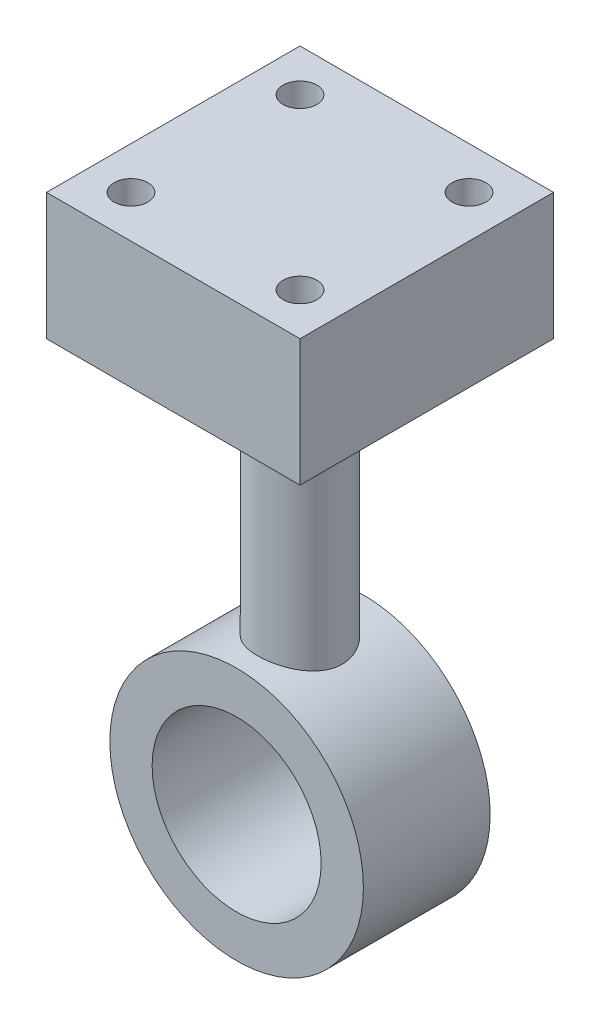
ISO-10303-21;
HEADER;
FILE_DESCRIPTION(('STEP AP214'),'2;1');
FILE_NAME('part.step','',(''),(''),'','','');
FILE_SCHEMA(('AUTOMOTIVE_DESIGN { 1 0 10303 214 1 1 1 1 }'));
ENDSEC;
DATA;
#1=APPLICATION_CONTEXT('core data for automotive mechanical design processes');
#2=APPLICATION_PROTOCOL_DEFINITION('international standard','automotive_design',2000,#1);
#3=PRODUCT_CONTEXT('',#1,'mechanical');
#4=PRODUCT('Part','Part','',(#3));
#5=PRODUCT_RELATED_PRODUCT_CATEGORY('part','',(#4));
#6=PRODUCT_DEFINITION_FORMATION('','',#4);
#7=PRODUCT_DEFINITION_CONTEXT('part definition',#1,'design');
#8=PRODUCT_DEFINITION('design','',#6,#7);
#9=PRODUCT_DEFINITION_SHAPE('','',#8);
#10=(LENGTH_UNIT() NAMED_UNIT(*) SI_UNIT(.MILLI.,.METRE.));
#11=(NAMED_UNIT(*) PLANE_ANGLE_UNIT() SI_UNIT($,.RADIAN.));
#12=(NAMED_UNIT(*) SI_UNIT($,.STERADIAN.) SOLID_ANGLE_UNIT());
#13=UNCERTAINTY_MEASURE_WITH_UNIT(LENGTH_MEASURE(1.E-05),#10,'distance_accuracy_value','');
#14=(GEOMETRIC_REPRESENTATION_CONTEXT(3) GLOBAL_UNCERTAINTY_ASSIGNED_CONTEXT((#13)) GLOBAL_UNIT_ASSIGNED_CONTEXT((#10,
#11,#12)) REPRESENTATION_CONTEXT('',''));
#15=CARTESIAN_POINT('',(0.,0.,0.));
#16=DIRECTION('',(0.,0.,1.));
#17=DIRECTION('',(1.,0.,0.));
#18=AXIS2_PLACEMENT_3D('',#15,#16,#17);
#19=CARTESIAN_POINT('',(0.,0.,7.5));
#20=DIRECTION('',(0.,0.,1.));
#21=DIRECTION('',(1.,0.,0.));
#22=AXIS2_PLACEMENT_3D('',#19,#20,#21);
#23=PLANE('',#22);
#24=CARTESIAN_POINT('',(0.,0.,7.5));
#25=DIRECTION('',(0.,0.,1.));
#26=DIRECTION('',(1.,0.,0.));
#27=AXIS2_PLACEMENT_3D('',#24,#25,#26);
#28=CIRCLE('',#27,15.);
#29=CARTESIAN_POINT('',(15.,0.,7.5));
#30=VERTEX_POINT('',#29);
#31=EDGE_CURVE('E11',#30,#30,#28,.T.);
#32=ORIENTED_EDGE('',*,*,#31,.T.);
#33=EDGE_LOOP('',(#32));
#34=FACE_BOUND('',#33,.T.);
#35=CARTESIAN_POINT('',(0.,0.,7.5));
#36=DIRECTION('',(0.,0.,1.));
#37=DIRECTION('',(1.,0.,0.));
#38=AXIS2_PLACEMENT_3D('',#35,#36,#37);
#39=CIRCLE('',#38,10.);
#40=CARTESIAN_POINT('',(10.,0.,7.5));
#41=VERTEX_POINT('',#40);
#42=EDGE_CURVE('E144',#41,#41,#39,.T.);
#43=ORIENTED_EDGE('',*,*,#42,.F.);
#44=EDGE_LOOP('',(#43));
#45=FACE_BOUND('',#44,.T.);
#46=ADVANCED_FACE('F39',(#34,#45),#23,.T.);
#47=CARTESIAN_POINT('',(0.,0.,-7.5));
#48=DIRECTION('',(0.,0.,1.));
#49=DIRECTION('',(1.,0.,0.));
#50=AXIS2_PLACEMENT_3D('',#47,#48,#49);
#51=PLANE('',#50);
#52=CARTESIAN_POINT('',(0.,0.,-7.5));
#53=DIRECTION('',(0.,0.,1.));
#54=DIRECTION('',(1.,0.,0.));
#55=AXIS2_PLACEMENT_3D('',#52,#53,#54);
#56=CIRCLE('',#55,15.);
#57=CARTESIAN_POINT('',(15.,0.,-7.5));
#58=VERTEX_POINT('',#57);
#59=EDGE_CURVE('E50',#58,#58,#56,.T.);
#60=ORIENTED_EDGE('',*,*,#59,.F.);
#61=EDGE_LOOP('',(#60));
#62=FACE_BOUND('',#61,.T.);
#63=CARTESIAN_POINT('',(0.,0.,-7.5));
#64=DIRECTION('',(0.,0.,1.));
#65=DIRECTION('',(1.,0.,0.));
#66=AXIS2_PLACEMENT_3D('',#63,#64,#65);
#67=CIRCLE('',#66,10.);
#68=CARTESIAN_POINT('',(10.,0.,-7.5));
#69=VERTEX_POINT('',#68);
#70=EDGE_CURVE('E143',#69,#69,#67,.T.);
#71=ORIENTED_EDGE('',*,*,#70,.T.);
#72=EDGE_LOOP('',(#71));
#73=FACE_BOUND('',#72,.T.);
#74=ADVANCED_FACE('F189',(#62,#73),#51,.F.);
#75=CARTESIAN_POINT('',(0.,0.,7.5));
#76=DIRECTION('',(0.,0.,-1.));
#77=DIRECTION('',(-1.,0.,0.));
#78=AXIS2_PLACEMENT_3D('',#75,#76,#77);
#79=CYLINDRICAL_SURFACE('',#78,15.);
#80=CARTESIAN_POINT('',(0.,15.,5.));
#81=CARTESIAN_POINT('',(0.272816814433608,15.0000007650471,5.00000126865821));
#82=CARTESIAN_POINT('',(0.54562597269272,14.9924884753769,4.97759866936396));
#83=CARTESIAN_POINT('',(1.08320880436489,14.9632605101644,4.88885445591387));
#84=CARTESIAN_POINT('',(1.3479816405942,14.941543360109,4.82250828025524));
#85=CARTESIAN_POINT('',(1.86166394750877,14.8862653953208,4.64840378307991));
#86=CARTESIAN_POINT('',(2.11059912942976,14.8527243865377,4.5407146877042));
#87=CARTESIAN_POINT('',(2.58687468402704,14.7772222858721,4.2872941358077));
#88=CARTESIAN_POINT('',(2.81421078479507,14.7352595334076,4.1415551749849));
#89=CARTESIAN_POINT('',(3.24870837510974,14.6457047221309,3.8108709757084));
#90=CARTESIAN_POINT('',(3.45501850148552,14.5979778231161,3.62484382870571));
#91=CARTESIAN_POINT('',(3.83416346351645,14.5030157392292,3.22116422645899));
#92=CARTESIAN_POINT('',(4.00699092746984,14.4557806648007,3.00350482532687));
#93=CARTESIAN_POINT('',(4.31912471111898,14.3656666235818,2.53507442404485));
#94=CARTESIAN_POINT('',(4.45732429102251,14.3229519627198,2.28353130144922));
#95=CARTESIAN_POINT('',(4.68909436930558,14.2487652698844,1.75911952782114));
#96=CARTESIAN_POINT('',(4.78267848691248,14.2172898077928,1.48625741422144));
#97=CARTESIAN_POINT('',(4.91936730756488,14.1705651637056,0.936633892488757));
#98=CARTESIAN_POINT('',(4.96406724136036,14.1548047884338,0.660313957540243));
#99=CARTESIAN_POINT('',(5.00670561667087,14.1397828315221,0.103681229235027));
#100=CARTESIAN_POINT('',(5.00465850803659,14.1405161515599,-0.176630303515914));
#101=CARTESIAN_POINT('',(4.95509951850356,14.1579507500054,-0.719683152261156));
#102=CARTESIAN_POINT('',(4.90966956578088,14.1739207918415,-0.982642014718556));
#103=CARTESIAN_POINT('',(4.77803081419367,14.2188328846856,-1.49696709815057));
#104=CARTESIAN_POINT('',(4.69181713294739,14.2477764887883,-1.74833192720231));
#105=CARTESIAN_POINT('',(4.47969529031769,14.3158955569848,-2.2370637479197));
#106=CARTESIAN_POINT('',(4.35317024354078,14.3552282897692,-2.47414012733751));
#107=CARTESIAN_POINT('',(4.06444553151123,14.4396279286729,-2.92435454140875));
#108=CARTESIAN_POINT('',(3.9022355618188,14.4846964894921,-3.13748563466968));
#109=CARTESIAN_POINT('',(3.53674666341248,14.5783664584198,-3.54545799080094));
#110=CARTESIAN_POINT('',(3.3317657503819,14.6270294677509,-3.73876347254456));
#111=CARTESIAN_POINT('',(2.89169784984998,14.7203469193431,-4.08865633331777));
#112=CARTESIAN_POINT('',(2.65660797830398,14.765000976901,-4.24524019082269));
#113=CARTESIAN_POINT('',(2.15973806523143,14.8458553968921,-4.51848150117513));
#114=CARTESIAN_POINT('',(1.89771638208171,14.8819675004026,-4.6347274567036));
#115=CARTESIAN_POINT('',(1.35634541682251,14.9410283572211,-4.82101586977861));
#116=CARTESIAN_POINT('',(1.07700219077476,14.9639816827438,-4.8910743771172));
#117=CARTESIAN_POINT('',(0.521919147646527,14.9933813535722,-4.98027833011178));
#118=CARTESIAN_POINT('',(0.246547999324233,15.0005000916864,-5.00149904586375));
#119=CARTESIAN_POINT('',(-0.303875349801188,14.9994451347413,-4.99833663200766));
#120=CARTESIAN_POINT('',(-0.578927596598252,14.9912740209681,-4.97396120010062));
#121=CARTESIAN_POINT('',(-1.11259933152128,14.9610012358552,-4.88194046132021));
#122=CARTESIAN_POINT('',(-1.37146403417421,14.9393099355596,-4.81556896975253));
#123=CARTESIAN_POINT('',(-1.87427979289787,14.8845923415035,-4.64303277766636));
#124=CARTESIAN_POINT('',(-2.11822894254303,14.8515646023338,-4.53686300266107));
#125=CARTESIAN_POINT('',(-2.59144148196636,14.7764465643645,-4.28464784079607));
#126=CARTESIAN_POINT('',(-2.82014979608573,14.7341407377893,-4.13762703358415));
#127=CARTESIAN_POINT('',(-3.25032415067793,14.6452626958131,-3.80902924993259));
#128=CARTESIAN_POINT('',(-3.45178183897788,14.5986891796914,-3.62744171984118));
#129=CARTESIAN_POINT('',(-3.8312625390315,14.5038423990222,-3.22510624496706));
#130=CARTESIAN_POINT('',(-4.00780484622885,14.4555880543714,-3.0029538653657));
#131=CARTESIAN_POINT('',(-4.32128761161787,14.3649986647354,-2.53114216094556));
#132=CARTESIAN_POINT('',(-4.45822773965507,14.3226636691001,-2.28148260682962));
#133=CARTESIAN_POINT('',(-4.68798465208181,14.2491195895692,-1.76163492355052));
#134=CARTESIAN_POINT('',(-4.7808906608251,14.2178880396489,-1.49148960415617));
#135=CARTESIAN_POINT('',(-4.91947333379678,14.1705416153225,-0.938106749779349));
#136=CARTESIAN_POINT('',(-4.9651712747697,14.154419931182,-0.654875172978255));
#137=CARTESIAN_POINT('',(-5.00638141238671,14.1398929437089,-0.0990145197954211));
#138=CARTESIAN_POINT('',(-5.004351286542,14.1406200128708,0.173411701434114));
#139=CARTESIAN_POINT('',(-4.95621146724347,14.1575634911934,0.71382537461031));
#140=CARTESIAN_POINT('',(-4.91010439729293,14.1737789784681,0.981813089775441));
#141=CARTESIAN_POINT('',(-4.77685906564673,14.2192262152446,1.50067831501236));
#142=CARTESIAN_POINT('',(-4.69051673007757,14.2482049011239,1.75178412502248));
#143=CARTESIAN_POINT('',(-4.47989682879873,14.3158199409234,2.23613703469134));
#144=CARTESIAN_POINT('',(-4.35561084276903,14.3544584381697,2.46938015594003));
#145=CARTESIAN_POINT('',(-4.06630346291715,14.4391414613023,2.92241834961456));
#146=CARTESIAN_POINT('',(-3.8997412138229,14.4854355821069,3.14118250949193));
#147=CARTESIAN_POINT('',(-3.53321441567824,14.5791678141626,3.548449066921));
#148=CARTESIAN_POINT('',(-3.33324042225741,14.6266062456186,3.73694287844037));
#149=CARTESIAN_POINT('',(-2.89620778460344,14.7195015262772,4.08572206144589));
#150=CARTESIAN_POINT('',(-2.65800756749864,14.7648090900628,4.244621738755));
#151=CARTESIAN_POINT('',(-2.15678678703312,14.8462995586306,4.51995214425323));
#152=CARTESIAN_POINT('',(-1.89377259066174,14.8824847953965,4.63639372961021));
#153=CARTESIAN_POINT('',(-1.36246823600488,14.9402757534271,4.81860816244336));
#154=CARTESIAN_POINT('',(-1.09493878838204,14.9624606211261,4.88641233131688));
#155=CARTESIAN_POINT('',(-0.551602080051232,14.9923203532111,4.97710140338563));
#156=CARTESIAN_POINT('',(-0.275797127843724,14.9999992265953,4.99999871748267));
#157=CARTESIAN_POINT('',(0.,15.,5.));
#158=B_SPLINE_CURVE_WITH_KNOTS('',3,(#80,#81,#82,#83,#84,#85,#86,#87,#88,#89,#90,#91,#92,#93,
#94,#95,#96,#97,#98,#99,#100,#101,#102,#103,#104,#105,#106,#107,#108,#109,#110,#111,#112,#113,
#114,#115,#116,#117,#118,#119,#120,#121,#122,#123,#124,#125,#126,#127,#128,#129,#130,#131,#132,
#133,#134,#135,#136,#137,#138,#139,#140,#141,#142,#143,#144,#145,#146,#147,#148,#149,#150,#151,
#152,#153,#154,#155,#156,#157),.UNSPECIFIED.,.T.,.F.,(4,2,2,2,2,2,2,2,2,2,2,2,2,2,2,2,2,2,2,2,2,
2,2,2,2,2,2,2,2,2,2,2,2,2,2,2,2,2,4),(0.,0.817435530130055,1.6349559263376,2.45111336435137,
3.2674318889955,4.1092342141378,4.95122166437651,5.81741924118921,6.6833522346775,
7.52009628712783,8.3565816994101,9.15484132763713,9.9531965428806,10.764408557863,
11.5758551280169,12.4296652906748,13.2835572984374,14.1459202826244,15.0079834439669,
15.832679158865,16.6572356583153,17.4579078990172,18.2586822643117,19.0805199922933,
19.9026090412011,20.7620511441441,21.6215004118563,22.479200691445,23.3365142353985,
24.1497833033194,24.9630039676753,25.7607793541274,26.5587319089054,27.3915033346967,
28.2245105562954,29.0899830418615,29.9552340577293,30.7818279187972,31.6081933020135),.UNSPECIFIED.);
#159=CARTESIAN_POINT('',(0.,15.,5.));
#160=VERTEX_POINT('',#159);
#161=EDGE_CURVE('E134',#160,#160,#158,.T.);
#162=ORIENTED_EDGE('',*,*,#161,.F.);
#163=EDGE_LOOP('',(#162));
#164=FACE_BOUND('',#163,.T.);
#165=ORIENTED_EDGE('',*,*,#31,.F.);
#166=EDGE_LOOP('',(#165));
#167=FACE_BOUND('',#166,.T.);
#168=ORIENTED_EDGE('',*,*,#59,.T.);
#169=EDGE_LOOP('',(#168));
#170=FACE_BOUND('',#169,.T.);
#171=ADVANCED_FACE('F41',(#164,#167,#170),#79,.T.);
#172=CARTESIAN_POINT('',(0.,0.,7.5));
#173=DIRECTION('',(0.,0.,-1.));
#174=DIRECTION('',(-1.,0.,0.));
#175=AXIS2_PLACEMENT_3D('',#172,#173,#174);
#176=CYLINDRICAL_SURFACE('',#175,10.);
#177=ORIENTED_EDGE('',*,*,#42,.T.);
#178=EDGE_LOOP('',(#177));
#179=FACE_BOUND('',#178,.T.);
#180=ORIENTED_EDGE('',*,*,#70,.F.);
#181=EDGE_LOOP('',(#180));
#182=FACE_BOUND('',#181,.T.);
#183=ADVANCED_FACE('F197',(#179,#182),#176,.F.);
#184=CARTESIAN_POINT('',(0.,-15.001,0.));
#185=DIRECTION('',(0.,1.,0.));
#186=DIRECTION('',(0.,0.,1.));
#187=AXIS2_PLACEMENT_3D('',#184,#185,#186);
#188=CYLINDRICAL_SURFACE('',#187,5.);
#189=CARTESIAN_POINT('',(0.,45.,0.));
#190=DIRECTION('',(0.,1.,0.));
#191=DIRECTION('',(0.,0.,1.));
#192=AXIS2_PLACEMENT_3D('',#189,#190,#191);
#193=CIRCLE('',#192,5.);
#194=CARTESIAN_POINT('',(0.,45.,5.));
#195=VERTEX_POINT('',#194);
#196=EDGE_CURVE('E130',#195,#195,#193,.T.);
#197=ORIENTED_EDGE('',*,*,#196,.F.);
#198=EDGE_LOOP('',(#197));
#199=FACE_BOUND('',#198,.T.);
#200=ORIENTED_EDGE('',*,*,#161,.T.);
#201=EDGE_LOOP('',(#200));
#202=FACE_BOUND('',#201,.T.);
#203=ADVANCED_FACE('F146',(#199,#202),#188,.T.);
#204=CARTESIAN_POINT('',(15.,60.,-15.));
#205=DIRECTION('',(-1.,0.,0.));
#206=DIRECTION('',(0.,0.,1.));
#207=AXIS2_PLACEMENT_3D('',#204,#205,#206);
#208=PLANE('',#207);
#209=DIRECTION('',(0.,0.,-1.));
#210=VECTOR('',#209,1.);
#211=CARTESIAN_POINT('',(15.,45.,-15.));
#212=LINE('',#211,#210);
#213=CARTESIAN_POINT('',(15.,45.,15.));
#214=VERTEX_POINT('',#213);
#215=CARTESIAN_POINT('',(15.,45.,-15.));
#216=VERTEX_POINT('',#215);
#217=EDGE_CURVE('E114',#214,#216,#212,.T.);
#218=ORIENTED_EDGE('',*,*,#217,.T.);
#219=DIRECTION('',(0.,-1.,0.));
#220=VECTOR('',#219,1.);
#221=CARTESIAN_POINT('',(15.,60.,-15.));
#222=LINE('',#221,#220);
#223=CARTESIAN_POINT('',(15.,60.,-15.));
#224=VERTEX_POINT('',#223);
#225=EDGE_CURVE('E103',#224,#216,#222,.T.);
#226=ORIENTED_EDGE('',*,*,#225,.F.);
#227=DIRECTION('',(0.,0.,-1.));
#228=VECTOR('',#227,1.);
#229=CARTESIAN_POINT('',(15.,60.,-15.));
#230=LINE('',#229,#228);
#231=CARTESIAN_POINT('',(15.,60.,15.));
#232=VERTEX_POINT('',#231);
#233=EDGE_CURVE('E95',#232,#224,#230,.T.);
#234=ORIENTED_EDGE('',*,*,#233,.F.);
#235=DIRECTION('',(0.,-1.,0.));
#236=VECTOR('',#235,1.);
#237=CARTESIAN_POINT('',(15.,60.,15.));
#238=LINE('',#237,#236);
#239=EDGE_CURVE('E110',#232,#214,#238,.T.);
#240=ORIENTED_EDGE('',*,*,#239,.T.);
#241=EDGE_LOOP('',(#218,#226,#234,#240));
#242=FACE_BOUND('',#241,.T.);
#243=ADVANCED_FACE('F151',(#242),#208,.F.);
#244=CARTESIAN_POINT('',(-15.,60.,-15.));
#245=DIRECTION('',(0.,0.,1.));
#246=DIRECTION('',(1.,0.,0.));
#247=AXIS2_PLACEMENT_3D('',#244,#245,#246);
#248=PLANE('',#247);
#249=DIRECTION('',(-1.,0.,0.));
#250=VECTOR('',#249,1.);
#251=CARTESIAN_POINT('',(-15.,45.,-15.));
#252=LINE('',#251,#250);
#253=CARTESIAN_POINT('',(-15.,45.,-15.));
#254=VERTEX_POINT('',#253);
#255=EDGE_CURVE('E101',#216,#254,#252,.T.);
#256=ORIENTED_EDGE('',*,*,#255,.T.);
#257=DIRECTION('',(0.,-1.,0.));
#258=VECTOR('',#257,1.);
#259=CARTESIAN_POINT('',(-15.,60.,-15.));
#260=LINE('',#259,#258);
#261=CARTESIAN_POINT('',(-15.,60.,-15.));
#262=VERTEX_POINT('',#261);
#263=EDGE_CURVE('E99',#262,#254,#260,.T.);
#264=ORIENTED_EDGE('',*,*,#263,.F.);
#265=DIRECTION('',(-1.,0.,0.));
#266=VECTOR('',#265,1.);
#267=CARTESIAN_POINT('',(-15.,60.,-15.));
#268=LINE('',#267,#266);
#269=EDGE_CURVE('E90',#224,#262,#268,.T.);
#270=ORIENTED_EDGE('',*,*,#269,.F.);
#271=ORIENTED_EDGE('',*,*,#225,.T.);
#272=EDGE_LOOP('',(#256,#264,#270,#271));
#273=FACE_BOUND('',#272,.T.);
#274=ADVANCED_FACE('F100',(#273),#248,.F.);
#275=CARTESIAN_POINT('',(-15.,60.,-15.));
#276=DIRECTION('',(1.,0.,0.));
#277=DIRECTION('',(0.,0.,-1.));
#278=AXIS2_PLACEMENT_3D('',#275,#276,#277);
#279=PLANE('',#278);
#280=DIRECTION('',(0.,0.,1.));
#281=VECTOR('',#280,1.);
#282=CARTESIAN_POINT('',(-15.,45.,-15.));
#283=LINE('',#282,#281);
#284=CARTESIAN_POINT('',(-15.,45.,15.));
#285=VERTEX_POINT('',#284);
#286=EDGE_CURVE('E76',#254,#285,#283,.T.);
#287=ORIENTED_EDGE('',*,*,#286,.T.);
#288=DIRECTION('',(0.,-1.,0.));
#289=VECTOR('',#288,1.);
#290=CARTESIAN_POINT('',(-15.,60.,15.));
#291=LINE('',#290,#289);
#292=CARTESIAN_POINT('',(-15.,60.,15.));
#293=VERTEX_POINT('',#292);
#294=EDGE_CURVE('E104',#293,#285,#291,.T.);
#295=ORIENTED_EDGE('',*,*,#294,.F.);
#296=DIRECTION('',(0.,0.,1.));
#297=VECTOR('',#296,1.);
#298=CARTESIAN_POINT('',(-15.,60.,-15.));
#299=LINE('',#298,#297);
#300=EDGE_CURVE('E93',#262,#293,#299,.T.);
#301=ORIENTED_EDGE('',*,*,#300,.F.);
#302=ORIENTED_EDGE('',*,*,#263,.T.);
#303=EDGE_LOOP('',(#287,#295,#301,#302));
#304=FACE_BOUND('',#303,.T.);
#305=ADVANCED_FACE('F106',(#304),#279,.F.);
#306=CARTESIAN_POINT('',(-15.,60.,15.));
#307=DIRECTION('',(0.,0.,-1.));
#308=DIRECTION('',(-1.,0.,0.));
#309=AXIS2_PLACEMENT_3D('',#306,#307,#308);
#310=PLANE('',#309);
#311=DIRECTION('',(1.,0.,0.));
#312=VECTOR('',#311,1.);
#313=CARTESIAN_POINT('',(-15.,45.,15.));
#314=LINE('',#313,#312);
#315=EDGE_CURVE('E82',#285,#214,#314,.T.);
#316=ORIENTED_EDGE('',*,*,#315,.T.);
#317=ORIENTED_EDGE('',*,*,#239,.F.);
#318=DIRECTION('',(1.,0.,0.));
#319=VECTOR('',#318,1.);
#320=CARTESIAN_POINT('',(-15.,60.,15.));
#321=LINE('',#320,#319);
#322=EDGE_CURVE('E59',#293,#232,#321,.T.);
#323=ORIENTED_EDGE('',*,*,#322,.F.);
#324=ORIENTED_EDGE('',*,*,#294,.T.);
#325=EDGE_LOOP('',(#316,#317,#323,#324));
#326=FACE_BOUND('',#325,.T.);
#327=ADVANCED_FACE('F159',(#326),#310,.F.);
#328=CARTESIAN_POINT('',(0.,60.,0.));
#329=DIRECTION('',(0.,1.,0.));
#330=DIRECTION('',(0.,0.,1.));
#331=AXIS2_PLACEMENT_3D('',#328,#329,#330);
#332=PLANE('',#331);
#333=CARTESIAN_POINT('',(-10.,60.,-10.));
#334=DIRECTION('',(0.,1.,0.));
#335=DIRECTION('',(0.,0.,-1.));
#336=AXIS2_PLACEMENT_3D('',#333,#334,#335);
#337=CIRCLE('',#336,2.);
#338=CARTESIAN_POINT('',(-10.,60.,-12.));
#339=VERTEX_POINT('',#338);
#340=EDGE_CURVE('E248',#339,#339,#337,.T.);
#341=ORIENTED_EDGE('',*,*,#340,.F.);
#342=EDGE_LOOP('',(#341));
#343=FACE_BOUND('',#342,.T.);
#344=CARTESIAN_POINT('',(10.,60.,10.));
#345=DIRECTION('',(0.,1.,0.));
#346=DIRECTION('',(0.,0.,-1.));
#347=AXIS2_PLACEMENT_3D('',#344,#345,#346);
#348=CIRCLE('',#347,2.);
#349=CARTESIAN_POINT('',(10.,60.,8.));
#350=VERTEX_POINT('',#349);
#351=EDGE_CURVE('E249',#350,#350,#348,.T.);
#352=ORIENTED_EDGE('',*,*,#351,.F.);
#353=EDGE_LOOP('',(#352));
#354=FACE_BOUND('',#353,.T.);
#355=CARTESIAN_POINT('',(-10.,60.,10.));
#356=DIRECTION('',(0.,1.,0.));
#357=DIRECTION('',(0.,0.,1.));
#358=AXIS2_PLACEMENT_3D('',#355,#356,#357);
#359=CIRCLE('',#358,2.);
#360=CARTESIAN_POINT('',(-10.,60.,12.));
#361=VERTEX_POINT('',#360);
#362=EDGE_CURVE('E253',#361,#361,#359,.T.);
#363=ORIENTED_EDGE('',*,*,#362,.F.);
#364=EDGE_LOOP('',(#363));
#365=FACE_BOUND('',#364,.T.);
#366=CARTESIAN_POINT('',(10.,60.,-10.));
#367=DIRECTION('',(0.,1.,0.));
#368=DIRECTION('',(0.,0.,1.));
#369=AXIS2_PLACEMENT_3D('',#366,#367,#368);
#370=CIRCLE('',#369,2.);
#371=CARTESIAN_POINT('',(10.,60.,-8.));
#372=VERTEX_POINT('',#371);
#373=EDGE_CURVE('E223',#372,#372,#370,.T.);
#374=ORIENTED_EDGE('',*,*,#373,.F.);
#375=EDGE_LOOP('',(#374));
#376=FACE_BOUND('',#375,.T.);
#377=ORIENTED_EDGE('',*,*,#233,.T.);
#378=ORIENTED_EDGE('',*,*,#269,.T.);
#379=ORIENTED_EDGE('',*,*,#300,.T.);
#380=ORIENTED_EDGE('',*,*,#322,.T.);
#381=EDGE_LOOP('',(#377,#378,#379,#380));
#382=FACE_BOUND('',#381,.T.);
#383=ADVANCED_FACE('F91',(#343,#354,#365,#376,#382),#332,.T.);
#384=CARTESIAN_POINT('',(0.,45.,0.));
#385=DIRECTION('',(0.,1.,0.));
#386=DIRECTION('',(0.,0.,1.));
#387=AXIS2_PLACEMENT_3D('',#384,#385,#386);
#388=PLANE('',#387);
#389=CARTESIAN_POINT('',(-10.,45.,-10.));
#390=DIRECTION('',(0.,1.,0.));
#391=DIRECTION('',(0.,0.,1.));
#392=AXIS2_PLACEMENT_3D('',#389,#390,#391);
#393=CIRCLE('',#392,2.);
#394=CARTESIAN_POINT('',(-10.,45.,-8.));
#395=VERTEX_POINT('',#394);
#396=EDGE_CURVE('E43',#395,#395,#393,.T.);
#397=ORIENTED_EDGE('',*,*,#396,.T.);
#398=EDGE_LOOP('',(#397));
#399=FACE_BOUND('',#398,.T.);
#400=CARTESIAN_POINT('',(10.,45.,10.));
#401=DIRECTION('',(0.,1.,0.));
#402=DIRECTION('',(0.,0.,1.));
#403=AXIS2_PLACEMENT_3D('',#400,#401,#402);
#404=CIRCLE('',#403,2.);
#405=CARTESIAN_POINT('',(10.,45.,12.));
#406=VERTEX_POINT('',#405);
#407=EDGE_CURVE('E226',#406,#406,#404,.T.);
#408=ORIENTED_EDGE('',*,*,#407,.T.);
#409=EDGE_LOOP('',(#408));
#410=FACE_BOUND('',#409,.T.);
#411=CARTESIAN_POINT('',(-10.,45.,10.));
#412=DIRECTION('',(0.,1.,0.));
#413=DIRECTION('',(0.,0.,1.));
#414=AXIS2_PLACEMENT_3D('',#411,#412,#413);
#415=CIRCLE('',#414,2.);
#416=CARTESIAN_POINT('',(-10.,45.,12.));
#417=VERTEX_POINT('',#416);
#418=EDGE_CURVE('E222',#417,#417,#415,.T.);
#419=ORIENTED_EDGE('',*,*,#418,.T.);
#420=EDGE_LOOP('',(#419));
#421=FACE_BOUND('',#420,.T.);
#422=CARTESIAN_POINT('',(10.,45.,-10.));
#423=DIRECTION('',(0.,1.,0.));
#424=DIRECTION('',(0.,0.,1.));
#425=AXIS2_PLACEMENT_3D('',#422,#423,#424);
#426=CIRCLE('',#425,2.);
#427=CARTESIAN_POINT('',(10.,45.,-8.));
#428=VERTEX_POINT('',#427);
#429=EDGE_CURVE('E218',#428,#428,#426,.T.);
#430=ORIENTED_EDGE('',*,*,#429,.T.);
#431=EDGE_LOOP('',(#430));
#432=FACE_BOUND('',#431,.T.);
#433=ORIENTED_EDGE('',*,*,#196,.T.);
#434=EDGE_LOOP('',(#433));
#435=FACE_BOUND('',#434,.T.);
#436=ORIENTED_EDGE('',*,*,#217,.F.);
#437=ORIENTED_EDGE('',*,*,#315,.F.);
#438=ORIENTED_EDGE('',*,*,#286,.F.);
#439=ORIENTED_EDGE('',*,*,#255,.F.);
#440=EDGE_LOOP('',(#436,#437,#438,#439));
#441=FACE_BOUND('',#440,.T.);
#442=ADVANCED_FACE('F162',(#399,#410,#421,#432,#435,#441),#388,.F.);
#443=CARTESIAN_POINT('',(10.,-15.,-10.));
#444=DIRECTION('',(0.,1.,0.));
#445=DIRECTION('',(0.,0.,1.));
#446=AXIS2_PLACEMENT_3D('',#443,#444,#445);
#447=CYLINDRICAL_SURFACE('',#446,2.);
#448=ORIENTED_EDGE('',*,*,#373,.T.);
#449=EDGE_LOOP('',(#448));
#450=FACE_BOUND('',#449,.T.);
#451=ORIENTED_EDGE('',*,*,#429,.F.);
#452=EDGE_LOOP('',(#451));
#453=FACE_BOUND('',#452,.T.);
#454=ADVANCED_FACE('F165',(#450,#453),#447,.F.);
#455=CARTESIAN_POINT('',(-10.,-15.,10.));
#456=DIRECTION('',(0.,1.,0.));
#457=DIRECTION('',(0.,0.,1.));
#458=AXIS2_PLACEMENT_3D('',#455,#456,#457);
#459=CYLINDRICAL_SURFACE('',#458,2.);
#460=ORIENTED_EDGE('',*,*,#362,.T.);
#461=EDGE_LOOP('',(#460));
#462=FACE_BOUND('',#461,.T.);
#463=ORIENTED_EDGE('',*,*,#418,.F.);
#464=EDGE_LOOP('',(#463));
#465=FACE_BOUND('',#464,.T.);
#466=ADVANCED_FACE('F172',(#462,#465),#459,.F.);
#467=CARTESIAN_POINT('',(10.,-15.,10.));
#468=DIRECTION('',(0.,1.,0.));
#469=DIRECTION('',(0.,0.,1.));
#470=AXIS2_PLACEMENT_3D('',#467,#468,#469);
#471=CYLINDRICAL_SURFACE('',#470,2.);
#472=ORIENTED_EDGE('',*,*,#351,.T.);
#473=EDGE_LOOP('',(#472));
#474=FACE_BOUND('',#473,.T.);
#475=ORIENTED_EDGE('',*,*,#407,.F.);
#476=EDGE_LOOP('',(#475));
#477=FACE_BOUND('',#476,.T.);
#478=ADVANCED_FACE('F174',(#474,#477),#471,.F.);
#479=CARTESIAN_POINT('',(-10.,-15.,-10.));
#480=DIRECTION('',(0.,1.,0.));
#481=DIRECTION('',(0.,0.,1.));
#482=AXIS2_PLACEMENT_3D('',#479,#480,#481);
#483=CYLINDRICAL_SURFACE('',#482,2.);
#484=ORIENTED_EDGE('',*,*,#340,.T.);
#485=EDGE_LOOP('',(#484));
#486=FACE_BOUND('',#485,.T.);
#487=ORIENTED_EDGE('',*,*,#396,.F.);
#488=EDGE_LOOP('',(#487));
#489=FACE_BOUND('',#488,.T.);
#490=ADVANCED_FACE('F177',(#486,#489),#483,.F.);
#491=CLOSED_SHELL('',(#46,#74,#171,#183,#203,#243,#274,#305,#327,#383,#442,#454,#466,#478,#490));
#492=MANIFOLD_SOLID_BREP('B2',#491);
#493=ADVANCED_BREP_SHAPE_REPRESENTATION('',(#18,#492),#14);
#494=SHAPE_DEFINITION_REPRESENTATION(#9,#493);
ENDSEC;
END-ISO-10303-21;
